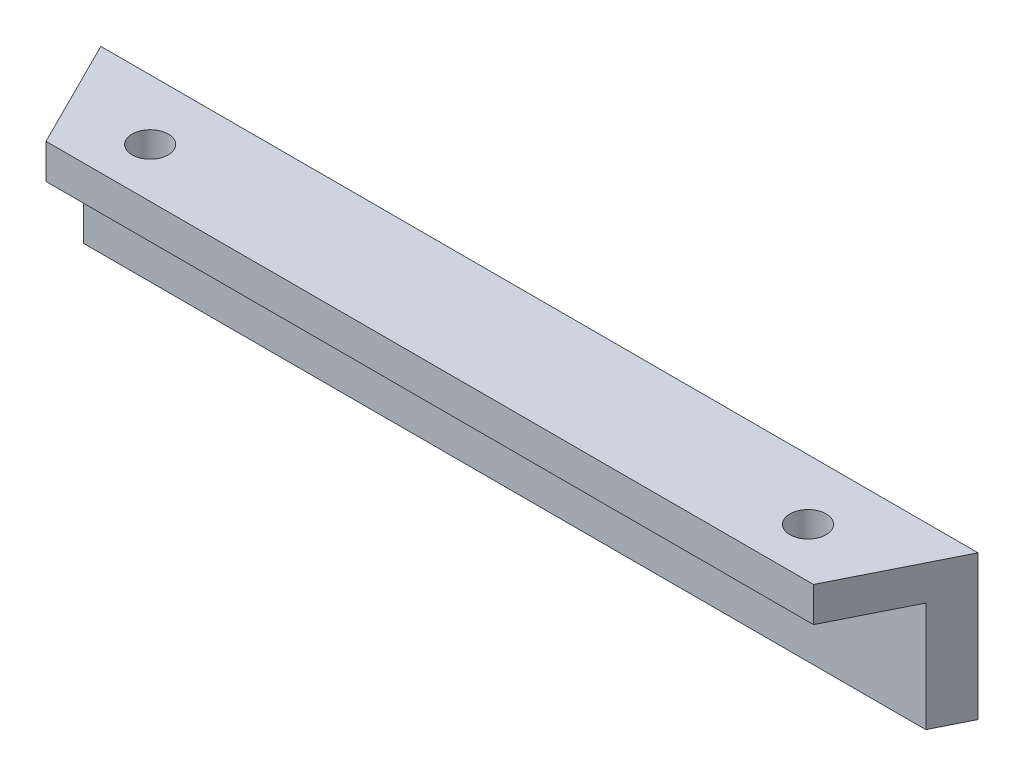
ISO-10303-21;
HEADER;
FILE_DESCRIPTION(('STEP AP214'),'2;1');
FILE_NAME('part.step','',(''),(''),'','','');
FILE_SCHEMA(('AUTOMOTIVE_DESIGN { 1 0 10303 214 1 1 1 1 }'));
ENDSEC;
DATA;
#1=APPLICATION_CONTEXT('core data for automotive mechanical design processes');
#2=APPLICATION_PROTOCOL_DEFINITION('international standard','automotive_design',2000,#1);
#3=PRODUCT_CONTEXT('',#1,'mechanical');
#4=PRODUCT('Part','Part','',(#3));
#5=PRODUCT_RELATED_PRODUCT_CATEGORY('part','',(#4));
#6=PRODUCT_DEFINITION_FORMATION('','',#4);
#7=PRODUCT_DEFINITION_CONTEXT('part definition',#1,'design');
#8=PRODUCT_DEFINITION('design','',#6,#7);
#9=PRODUCT_DEFINITION_SHAPE('','',#8);
#10=(LENGTH_UNIT() NAMED_UNIT(*) SI_UNIT(.MILLI.,.METRE.));
#11=(NAMED_UNIT(*) PLANE_ANGLE_UNIT() SI_UNIT($,.RADIAN.));
#12=(NAMED_UNIT(*) SI_UNIT($,.STERADIAN.) SOLID_ANGLE_UNIT());
#13=UNCERTAINTY_MEASURE_WITH_UNIT(LENGTH_MEASURE(1.E-05),#10,'distance_accuracy_value','');
#14=(GEOMETRIC_REPRESENTATION_CONTEXT(3) GLOBAL_UNCERTAINTY_ASSIGNED_CONTEXT((#13)) GLOBAL_UNIT_ASSIGNED_CONTEXT((#10,
#11,#12)) REPRESENTATION_CONTEXT('',''));
#15=CARTESIAN_POINT('',(0.,0.,0.));
#16=DIRECTION('',(0.,0.,1.));
#17=DIRECTION('',(1.,0.,0.));
#18=AXIS2_PLACEMENT_3D('',#15,#16,#17);
#19=CARTESIAN_POINT('',(0.,3.175,0.));
#20=DIRECTION('',(0.,-1.,0.));
#21=DIRECTION('',(0.,0.,-1.));
#22=AXIS2_PLACEMENT_3D('',#19,#20,#21);
#23=PLANE('',#22);
#24=DIRECTION('',(0.447213595499958,0.,0.894427190999916));
#25=VECTOR('',#24,1.);
#26=CARTESIAN_POINT('',(-16.9970845481049,3.175,9.99999999999999));
#27=LINE('',#26,#25);
#28=CARTESIAN_POINT('',(-21.9970845481049,3.175,0.));
#29=VERTEX_POINT('',#28);
#30=CARTESIAN_POINT('',(-16.9970845481049,3.175,9.99999999999999));
#31=VERTEX_POINT('',#30);
#32=EDGE_CURVE('E138',#29,#31,#27,.T.);
#33=ORIENTED_EDGE('',*,*,#32,.T.);
#34=DIRECTION('',(1.,0.,0.));
#35=VECTOR('',#34,1.);
#36=CARTESIAN_POINT('',(53.0029154518951,3.175,9.99999999999998));
#37=LINE('',#36,#35);
#38=CARTESIAN_POINT('',(53.0029154518951,3.175,9.99999999999998));
#39=VERTEX_POINT('',#38);
#40=EDGE_CURVE('E77',#31,#39,#37,.T.);
#41=ORIENTED_EDGE('',*,*,#40,.T.);
#42=DIRECTION('',(0.447213595499958,0.,-0.894427190999916));
#43=VECTOR('',#42,1.);
#44=CARTESIAN_POINT('',(58.0029154518951,3.175,0.));
#45=LINE('',#44,#43);
#46=CARTESIAN_POINT('',(58.0029154518951,3.175,0.));
#47=VERTEX_POINT('',#46);
#48=EDGE_CURVE('E142',#39,#47,#45,.T.);
#49=ORIENTED_EDGE('',*,*,#48,.T.);
#50=DIRECTION('',(-1.,0.,0.));
#51=VECTOR('',#50,1.);
#52=CARTESIAN_POINT('',(-21.9970845481049,3.175,0.));
#53=LINE('',#52,#51);
#54=EDGE_CURVE('E57',#47,#29,#53,.T.);
#55=ORIENTED_EDGE('',*,*,#54,.T.);
#56=EDGE_LOOP('',(#33,#41,#49,#55));
#57=FACE_BOUND('',#56,.T.);
#58=CARTESIAN_POINT('',(-11.9970845481049,3.175,5.5));
#59=DIRECTION('',(0.,1.,0.));
#60=DIRECTION('',(0.,0.,1.));
#61=AXIS2_PLACEMENT_3D('',#58,#59,#60);
#62=CIRCLE('',#61,1.65);
#63=CARTESIAN_POINT('',(-11.9970845481049,3.175,7.15));
#64=VERTEX_POINT('',#63);
#65=EDGE_CURVE('E132',#64,#64,#62,.T.);
#66=ORIENTED_EDGE('',*,*,#65,.F.);
#67=EDGE_LOOP('',(#66));
#68=FACE_BOUND('',#67,.T.);
#69=CARTESIAN_POINT('',(48.0029154518951,3.175,5.49999999999999));
#70=DIRECTION('',(0.,1.,0.));
#71=DIRECTION('',(0.,0.,-1.));
#72=AXIS2_PLACEMENT_3D('',#69,#70,#71);
#73=CIRCLE('',#72,1.65);
#74=CARTESIAN_POINT('',(48.0029154518951,3.175,3.84999999999999));
#75=VERTEX_POINT('',#74);
#76=EDGE_CURVE('E126',#75,#75,#73,.T.);
#77=ORIENTED_EDGE('',*,*,#76,.F.);
#78=EDGE_LOOP('',(#77));
#79=FACE_BOUND('',#78,.T.);
#80=ADVANCED_FACE('F33',(#57,#68,#79),#23,.F.);
#81=CARTESIAN_POINT('',(0.,0.,0.));
#82=DIRECTION('',(0.,-1.,0.));
#83=DIRECTION('',(0.,0.,-1.));
#84=AXIS2_PLACEMENT_3D('',#81,#82,#83);
#85=PLANE('',#84);
#86=DIRECTION('',(-1.,0.,0.));
#87=VECTOR('',#86,1.);
#88=CARTESIAN_POINT('',(56.4154154518951,0.,3.175));
#89=LINE('',#88,#87);
#90=CARTESIAN_POINT('',(56.4154154518951,0.,3.175));
#91=VERTEX_POINT('',#90);
#92=CARTESIAN_POINT('',(-20.4095845481049,0.,3.17499999999999));
#93=VERTEX_POINT('',#92);
#94=EDGE_CURVE('E48',#91,#93,#89,.T.);
#95=ORIENTED_EDGE('',*,*,#94,.F.);
#96=DIRECTION('',(0.447213595499958,0.,-0.894427190999916));
#97=VECTOR('',#96,1.);
#98=CARTESIAN_POINT('',(58.0029154518951,0.,0.));
#99=LINE('',#98,#97);
#100=CARTESIAN_POINT('',(53.0029154518951,0.,9.99999999999998));
#101=VERTEX_POINT('',#100);
#102=EDGE_CURVE('E140',#101,#91,#99,.T.);
#103=ORIENTED_EDGE('',*,*,#102,.F.);
#104=DIRECTION('',(1.,0.,0.));
#105=VECTOR('',#104,1.);
#106=CARTESIAN_POINT('',(53.0029154518951,0.,9.99999999999998));
#107=LINE('',#106,#105);
#108=CARTESIAN_POINT('',(-16.9970845481049,0.,9.99999999999999));
#109=VERTEX_POINT('',#108);
#110=EDGE_CURVE('E72',#109,#101,#107,.T.);
#111=ORIENTED_EDGE('',*,*,#110,.F.);
#112=DIRECTION('',(0.447213595499958,0.,0.894427190999916));
#113=VECTOR('',#112,1.);
#114=CARTESIAN_POINT('',(-16.9970845481049,0.,9.99999999999999));
#115=LINE('',#114,#113);
#116=EDGE_CURVE('E135',#93,#109,#115,.T.);
#117=ORIENTED_EDGE('',*,*,#116,.F.);
#118=EDGE_LOOP('',(#95,#103,#111,#117));
#119=FACE_BOUND('',#118,.T.);
#120=CARTESIAN_POINT('',(-11.9970845481049,0.,5.5));
#121=DIRECTION('',(0.,1.,0.));
#122=DIRECTION('',(0.,0.,1.));
#123=AXIS2_PLACEMENT_3D('',#120,#121,#122);
#124=CIRCLE('',#123,1.65);
#125=CARTESIAN_POINT('',(-11.9970845481049,0.,7.15));
#126=VERTEX_POINT('',#125);
#127=EDGE_CURVE('E129',#126,#126,#124,.T.);
#128=ORIENTED_EDGE('',*,*,#127,.T.);
#129=EDGE_LOOP('',(#128));
#130=FACE_BOUND('',#129,.T.);
#131=CARTESIAN_POINT('',(48.0029154518951,0.,5.49999999999999));
#132=DIRECTION('',(0.,1.,0.));
#133=DIRECTION('',(0.,0.,-1.));
#134=AXIS2_PLACEMENT_3D('',#131,#132,#133);
#135=CIRCLE('',#134,1.65);
#136=CARTESIAN_POINT('',(48.0029154518951,0.,3.84999999999999));
#137=VERTEX_POINT('',#136);
#138=EDGE_CURVE('E125',#137,#137,#135,.T.);
#139=ORIENTED_EDGE('',*,*,#138,.T.);
#140=EDGE_LOOP('',(#139));
#141=FACE_BOUND('',#140,.T.);
#142=ADVANCED_FACE('F148',(#119,#130,#141),#85,.T.);
#143=CARTESIAN_POINT('',(-16.9970845481049,3.175,9.99999999999999));
#144=DIRECTION('',(0.894427190999916,0.,-0.447213595499958));
#145=DIRECTION('',(-0.447213595499958,0.,-0.894427190999916));
#146=AXIS2_PLACEMENT_3D('',#143,#144,#145);
#147=PLANE('',#146);
#148=DIRECTION('',(0.,-1.,0.));
#149=VECTOR('',#148,1.);
#150=CARTESIAN_POINT('',(-21.9970845481049,3.175,0.));
#151=LINE('',#150,#149);
#152=CARTESIAN_POINT('',(-21.9970845481049,-10.,0.));
#153=VERTEX_POINT('',#152);
#154=EDGE_CURVE('E101',#29,#153,#151,.T.);
#155=ORIENTED_EDGE('',*,*,#154,.T.);
#156=DIRECTION('',(-0.447213595499958,0.,-0.894427190999916));
#157=VECTOR('',#156,1.);
#158=CARTESIAN_POINT('',(-20.4095845481049,-10.,3.17499999999999));
#159=LINE('',#158,#157);
#160=CARTESIAN_POINT('',(-20.4095845481049,-10.,3.17499999999999));
#161=VERTEX_POINT('',#160);
#162=EDGE_CURVE('E115',#161,#153,#159,.T.);
#163=ORIENTED_EDGE('',*,*,#162,.F.);
#164=DIRECTION('',(0.,1.,0.));
#165=VECTOR('',#164,1.);
#166=CARTESIAN_POINT('',(-20.4095845481049,-10.,3.17499999999999));
#167=LINE('',#166,#165);
#168=EDGE_CURVE('E120',#161,#93,#167,.T.);
#169=ORIENTED_EDGE('',*,*,#168,.T.);
#170=ORIENTED_EDGE('',*,*,#116,.T.);
#171=DIRECTION('',(0.,-1.,0.));
#172=VECTOR('',#171,1.);
#173=CARTESIAN_POINT('',(-16.9970845481049,3.175,9.99999999999999));
#174=LINE('',#173,#172);
#175=EDGE_CURVE('E11',#31,#109,#174,.T.);
#176=ORIENTED_EDGE('',*,*,#175,.F.);
#177=ORIENTED_EDGE('',*,*,#32,.F.);
#178=EDGE_LOOP('',(#155,#163,#169,#170,#176,#177));
#179=FACE_BOUND('',#178,.T.);
#180=ADVANCED_FACE('F35',(#179),#147,.F.);
#181=CARTESIAN_POINT('',(53.0029154518951,3.175,9.99999999999998));
#182=DIRECTION('',(0.,0.,-1.));
#183=DIRECTION('',(-1.,0.,0.));
#184=AXIS2_PLACEMENT_3D('',#181,#182,#183);
#185=PLANE('',#184);
#186=ORIENTED_EDGE('',*,*,#110,.T.);
#187=DIRECTION('',(0.,-1.,0.));
#188=VECTOR('',#187,1.);
#189=CARTESIAN_POINT('',(53.0029154518951,3.175,9.99999999999998));
#190=LINE('',#189,#188);
#191=EDGE_CURVE('E41',#39,#101,#190,.T.);
#192=ORIENTED_EDGE('',*,*,#191,.F.);
#193=ORIENTED_EDGE('',*,*,#40,.F.);
#194=ORIENTED_EDGE('',*,*,#175,.T.);
#195=EDGE_LOOP('',(#186,#192,#193,#194));
#196=FACE_BOUND('',#195,.T.);
#197=ADVANCED_FACE('F151',(#196),#185,.F.);
#198=CARTESIAN_POINT('',(58.0029154518951,3.175,0.));
#199=DIRECTION('',(-0.894427190999916,0.,-0.447213595499958));
#200=DIRECTION('',(-0.447213595499958,0.,0.894427190999916));
#201=AXIS2_PLACEMENT_3D('',#198,#199,#200);
#202=PLANE('',#201);
#203=ORIENTED_EDGE('',*,*,#102,.T.);
#204=DIRECTION('',(0.,1.,0.));
#205=VECTOR('',#204,1.);
#206=CARTESIAN_POINT('',(56.4154154518951,-10.,3.175));
#207=LINE('',#206,#205);
#208=CARTESIAN_POINT('',(56.4154154518951,-10.,3.175));
#209=VERTEX_POINT('',#208);
#210=EDGE_CURVE('E107',#209,#91,#207,.T.);
#211=ORIENTED_EDGE('',*,*,#210,.F.);
#212=DIRECTION('',(-0.447213595499957,0.,0.894427190999916));
#213=VECTOR('',#212,1.);
#214=CARTESIAN_POINT('',(58.0029154518951,-10.,0.));
#215=LINE('',#214,#213);
#216=CARTESIAN_POINT('',(58.0029154518951,-10.,0.));
#217=VERTEX_POINT('',#216);
#218=EDGE_CURVE('E104',#217,#209,#215,.T.);
#219=ORIENTED_EDGE('',*,*,#218,.F.);
#220=DIRECTION('',(0.,-1.,0.));
#221=VECTOR('',#220,1.);
#222=CARTESIAN_POINT('',(58.0029154518951,3.175,0.));
#223=LINE('',#222,#221);
#224=EDGE_CURVE('E94',#47,#217,#223,.T.);
#225=ORIENTED_EDGE('',*,*,#224,.F.);
#226=ORIENTED_EDGE('',*,*,#48,.F.);
#227=ORIENTED_EDGE('',*,*,#191,.T.);
#228=EDGE_LOOP('',(#203,#211,#219,#225,#226,#227));
#229=FACE_BOUND('',#228,.T.);
#230=ADVANCED_FACE('F105',(#229),#202,.F.);
#231=CARTESIAN_POINT('',(-21.9970845481049,3.175,0.));
#232=DIRECTION('',(0.,0.,1.));
#233=DIRECTION('',(1.,0.,0.));
#234=AXIS2_PLACEMENT_3D('',#231,#232,#233);
#235=PLANE('',#234);
#236=ORIENTED_EDGE('',*,*,#224,.T.);
#237=DIRECTION('',(1.,0.,0.));
#238=VECTOR('',#237,1.);
#239=CARTESIAN_POINT('',(-21.9970845481049,-10.,0.));
#240=LINE('',#239,#238);
#241=EDGE_CURVE('E98',#153,#217,#240,.T.);
#242=ORIENTED_EDGE('',*,*,#241,.F.);
#243=ORIENTED_EDGE('',*,*,#154,.F.);
#244=ORIENTED_EDGE('',*,*,#54,.F.);
#245=EDGE_LOOP('',(#236,#242,#243,#244));
#246=FACE_BOUND('',#245,.T.);
#247=ADVANCED_FACE('F96',(#246),#235,.F.);
#248=CARTESIAN_POINT('',(-11.9970845481049,3.175,5.5));
#249=DIRECTION('',(0.,-1.,0.));
#250=DIRECTION('',(0.,0.,-1.));
#251=AXIS2_PLACEMENT_3D('',#248,#249,#250);
#252=CYLINDRICAL_SURFACE('',#251,1.65);
#253=ORIENTED_EDGE('',*,*,#65,.T.);
#254=EDGE_LOOP('',(#253));
#255=FACE_BOUND('',#254,.T.);
#256=ORIENTED_EDGE('',*,*,#127,.F.);
#257=EDGE_LOOP('',(#256));
#258=FACE_BOUND('',#257,.T.);
#259=ADVANCED_FACE('F165',(#255,#258),#252,.F.);
#260=CARTESIAN_POINT('',(48.0029154518951,3.175,5.49999999999999));
#261=DIRECTION('',(0.,-1.,0.));
#262=DIRECTION('',(0.,0.,-1.));
#263=AXIS2_PLACEMENT_3D('',#260,#261,#262);
#264=CYLINDRICAL_SURFACE('',#263,1.65);
#265=ORIENTED_EDGE('',*,*,#76,.T.);
#266=EDGE_LOOP('',(#265));
#267=FACE_BOUND('',#266,.T.);
#268=ORIENTED_EDGE('',*,*,#138,.F.);
#269=EDGE_LOOP('',(#268));
#270=FACE_BOUND('',#269,.T.);
#271=ADVANCED_FACE('F158',(#267,#270),#264,.F.);
#272=CARTESIAN_POINT('',(56.4154154518951,-10.,3.175));
#273=DIRECTION('',(0.,0.,-1.));
#274=DIRECTION('',(-1.,0.,0.));
#275=AXIS2_PLACEMENT_3D('',#272,#273,#274);
#276=PLANE('',#275);
#277=ORIENTED_EDGE('',*,*,#94,.T.);
#278=ORIENTED_EDGE('',*,*,#168,.F.);
#279=DIRECTION('',(-1.,0.,0.));
#280=VECTOR('',#279,1.);
#281=CARTESIAN_POINT('',(56.4154154518951,-10.,3.175));
#282=LINE('',#281,#280);
#283=EDGE_CURVE('E110',#209,#161,#282,.T.);
#284=ORIENTED_EDGE('',*,*,#283,.F.);
#285=ORIENTED_EDGE('',*,*,#210,.T.);
#286=EDGE_LOOP('',(#277,#278,#284,#285));
#287=FACE_BOUND('',#286,.T.);
#288=ADVANCED_FACE('F156',(#287),#276,.F.);
#289=CARTESIAN_POINT('',(0.,-10.,0.));
#290=DIRECTION('',(0.,-1.,0.));
#291=DIRECTION('',(0.,0.,-1.));
#292=AXIS2_PLACEMENT_3D('',#289,#290,#291);
#293=PLANE('',#292);
#294=ORIENTED_EDGE('',*,*,#241,.T.);
#295=ORIENTED_EDGE('',*,*,#218,.T.);
#296=ORIENTED_EDGE('',*,*,#283,.T.);
#297=ORIENTED_EDGE('',*,*,#162,.T.);
#298=EDGE_LOOP('',(#294,#295,#296,#297));
#299=FACE_BOUND('',#298,.T.);
#300=ADVANCED_FACE('F113',(#299),#293,.T.);
#301=CLOSED_SHELL('',(#80,#142,#180,#197,#230,#247,#259,#271,#288,#300));
#302=MANIFOLD_SOLID_BREP('B2',#301);
#303=ADVANCED_BREP_SHAPE_REPRESENTATION('',(#18,#302),#14);
#304=SHAPE_DEFINITION_REPRESENTATION(#9,#303);
ENDSEC;
END-ISO-10303-21;
